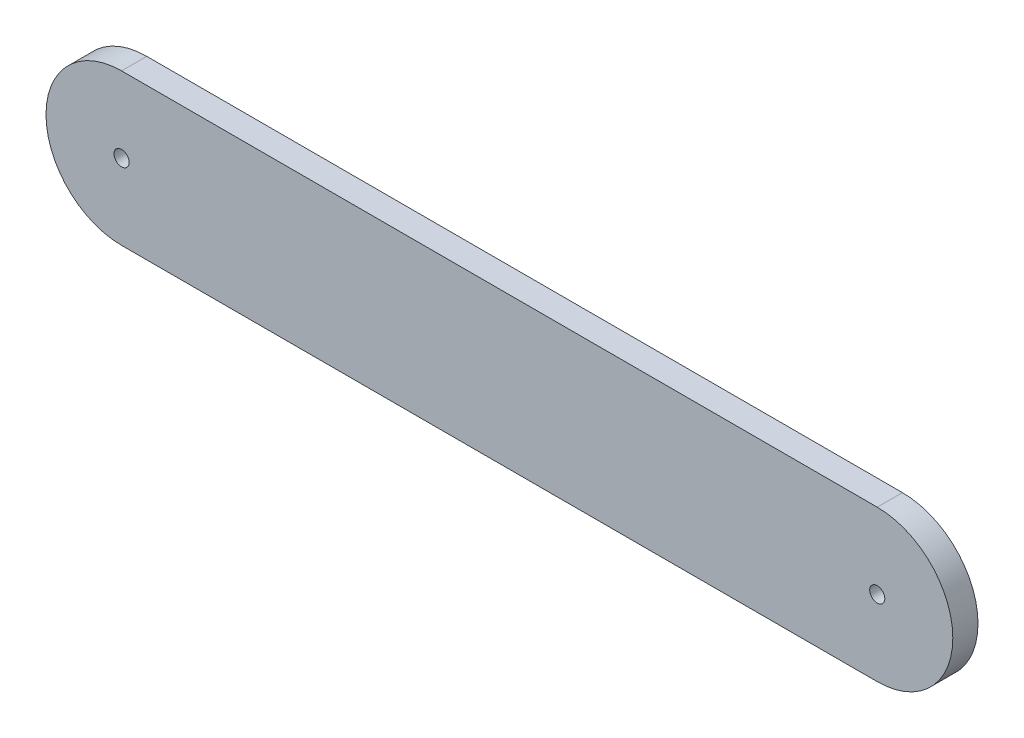
ISO-10303-21;
HEADER;
FILE_DESCRIPTION(('STEP AP214'),'2;1');
FILE_NAME('part.step','',(''),(''),'','','');
FILE_SCHEMA(('AUTOMOTIVE_DESIGN { 1 0 10303 214 1 1 1 1 }'));
ENDSEC;
DATA;
#1=APPLICATION_CONTEXT('core data for automotive mechanical design processes');
#2=APPLICATION_PROTOCOL_DEFINITION('international standard','automotive_design',2000,#1);
#3=PRODUCT_CONTEXT('',#1,'mechanical');
#4=PRODUCT('Part','Part','',(#3));
#5=PRODUCT_RELATED_PRODUCT_CATEGORY('part','',(#4));
#6=PRODUCT_DEFINITION_FORMATION('','',#4);
#7=PRODUCT_DEFINITION_CONTEXT('part definition',#1,'design');
#8=PRODUCT_DEFINITION('design','',#6,#7);
#9=PRODUCT_DEFINITION_SHAPE('','',#8);
#10=(LENGTH_UNIT() NAMED_UNIT(*) SI_UNIT(.MILLI.,.METRE.));
#11=(NAMED_UNIT(*) PLANE_ANGLE_UNIT() SI_UNIT($,.RADIAN.));
#12=(NAMED_UNIT(*) SI_UNIT($,.STERADIAN.) SOLID_ANGLE_UNIT());
#13=UNCERTAINTY_MEASURE_WITH_UNIT(LENGTH_MEASURE(1.E-05),#10,'distance_accuracy_value','');
#14=(GEOMETRIC_REPRESENTATION_CONTEXT(3) GLOBAL_UNCERTAINTY_ASSIGNED_CONTEXT((#13)) GLOBAL_UNIT_ASSIGNED_CONTEXT((#10,
#11,#12)) REPRESENTATION_CONTEXT('',''));
#15=CARTESIAN_POINT('',(0.,0.,0.));
#16=DIRECTION('',(0.,0.,1.));
#17=DIRECTION('',(1.,0.,0.));
#18=AXIS2_PLACEMENT_3D('',#15,#16,#17);
#19=CARTESIAN_POINT('',(-75.,0.,5.));
#20=DIRECTION('',(0.,0.,-1.));
#21=DIRECTION('',(-1.,0.,0.));
#22=AXIS2_PLACEMENT_3D('',#19,#20,#21);
#23=CYLINDRICAL_SURFACE('',#22,15.);
#24=CARTESIAN_POINT('',(-75.,0.,0.));
#25=DIRECTION('',(0.,0.,1.));
#26=DIRECTION('',(1.,0.,0.));
#27=AXIS2_PLACEMENT_3D('',#24,#25,#26);
#28=CIRCLE('',#27,15.);
#29=CARTESIAN_POINT('',(-75.,15.,0.));
#30=VERTEX_POINT('',#29);
#31=CARTESIAN_POINT('',(-75.,-15.,0.));
#32=VERTEX_POINT('',#31);
#33=EDGE_CURVE('E107',#30,#32,#28,.T.);
#34=ORIENTED_EDGE('',*,*,#33,.T.);
#35=DIRECTION('',(0.,0.,-1.));
#36=VECTOR('',#35,1.);
#37=CARTESIAN_POINT('',(-75.,-15.,5.));
#38=LINE('',#37,#36);
#39=CARTESIAN_POINT('',(-75.,-15.,5.));
#40=VERTEX_POINT('',#39);
#41=EDGE_CURVE('E11',#40,#32,#38,.T.);
#42=ORIENTED_EDGE('',*,*,#41,.F.);
#43=CARTESIAN_POINT('',(-75.,0.,5.));
#44=DIRECTION('',(0.,0.,1.));
#45=DIRECTION('',(1.,0.,0.));
#46=AXIS2_PLACEMENT_3D('',#43,#44,#45);
#47=CIRCLE('',#46,15.);
#48=CARTESIAN_POINT('',(-75.,15.,5.));
#49=VERTEX_POINT('',#48);
#50=EDGE_CURVE('E91',#49,#40,#47,.T.);
#51=ORIENTED_EDGE('',*,*,#50,.F.);
#52=DIRECTION('',(0.,0.,-1.));
#53=VECTOR('',#52,1.);
#54=CARTESIAN_POINT('',(-75.,15.,5.));
#55=LINE('',#54,#53);
#56=EDGE_CURVE('E103',#49,#30,#55,.T.);
#57=ORIENTED_EDGE('',*,*,#56,.T.);
#58=EDGE_LOOP('',(#34,#42,#51,#57));
#59=FACE_BOUND('',#58,.T.);
#60=ADVANCED_FACE('F39',(#59),#23,.T.);
#61=CARTESIAN_POINT('',(-75.,-15.,5.));
#62=DIRECTION('',(0.,1.,0.));
#63=DIRECTION('',(0.,0.,1.));
#64=AXIS2_PLACEMENT_3D('',#61,#62,#63);
#65=PLANE('',#64);
#66=DIRECTION('',(1.,0.,0.));
#67=VECTOR('',#66,1.);
#68=CARTESIAN_POINT('',(-75.,-15.,0.));
#69=LINE('',#68,#67);
#70=CARTESIAN_POINT('',(75.,-15.,0.));
#71=VERTEX_POINT('',#70);
#72=EDGE_CURVE('E96',#32,#71,#69,.T.);
#73=ORIENTED_EDGE('',*,*,#72,.T.);
#74=DIRECTION('',(0.,0.,-1.));
#75=VECTOR('',#74,1.);
#76=CARTESIAN_POINT('',(75.,-15.,5.));
#77=LINE('',#76,#75);
#78=CARTESIAN_POINT('',(75.,-15.,5.));
#79=VERTEX_POINT('',#78);
#80=EDGE_CURVE('E48',#79,#71,#77,.T.);
#81=ORIENTED_EDGE('',*,*,#80,.F.);
#82=DIRECTION('',(1.,0.,0.));
#83=VECTOR('',#82,1.);
#84=CARTESIAN_POINT('',(-75.,-15.,5.));
#85=LINE('',#84,#83);
#86=EDGE_CURVE('E86',#40,#79,#85,.T.);
#87=ORIENTED_EDGE('',*,*,#86,.F.);
#88=ORIENTED_EDGE('',*,*,#41,.T.);
#89=EDGE_LOOP('',(#73,#81,#87,#88));
#90=FACE_BOUND('',#89,.T.);
#91=ADVANCED_FACE('F95',(#90),#65,.F.);
#92=CARTESIAN_POINT('',(75.,0.,5.));
#93=DIRECTION('',(0.,0.,-1.));
#94=DIRECTION('',(-1.,0.,0.));
#95=AXIS2_PLACEMENT_3D('',#92,#93,#94);
#96=CYLINDRICAL_SURFACE('',#95,15.);
#97=CARTESIAN_POINT('',(75.,0.,0.));
#98=DIRECTION('',(0.,0.,1.));
#99=DIRECTION('',(1.,0.,0.));
#100=AXIS2_PLACEMENT_3D('',#97,#98,#99);
#101=CIRCLE('',#100,15.);
#102=CARTESIAN_POINT('',(75.,15.,0.));
#103=VERTEX_POINT('',#102);
#104=EDGE_CURVE('E73',#71,#103,#101,.T.);
#105=ORIENTED_EDGE('',*,*,#104,.T.);
#106=DIRECTION('',(0.,0.,-1.));
#107=VECTOR('',#106,1.);
#108=CARTESIAN_POINT('',(75.,15.,5.));
#109=LINE('',#108,#107);
#110=CARTESIAN_POINT('',(75.,15.,5.));
#111=VERTEX_POINT('',#110);
#112=EDGE_CURVE('E98',#111,#103,#109,.T.);
#113=ORIENTED_EDGE('',*,*,#112,.F.);
#114=CARTESIAN_POINT('',(75.,0.,5.));
#115=DIRECTION('',(0.,0.,1.));
#116=DIRECTION('',(1.,0.,0.));
#117=AXIS2_PLACEMENT_3D('',#114,#115,#116);
#118=CIRCLE('',#117,15.);
#119=EDGE_CURVE('E89',#79,#111,#118,.T.);
#120=ORIENTED_EDGE('',*,*,#119,.F.);
#121=ORIENTED_EDGE('',*,*,#80,.T.);
#122=EDGE_LOOP('',(#105,#113,#120,#121));
#123=FACE_BOUND('',#122,.T.);
#124=ADVANCED_FACE('F99',(#123),#96,.T.);
#125=CARTESIAN_POINT('',(-75.,15.,5.));
#126=DIRECTION('',(0.,-1.,0.));
#127=DIRECTION('',(0.,0.,-1.));
#128=AXIS2_PLACEMENT_3D('',#125,#126,#127);
#129=PLANE('',#128);
#130=DIRECTION('',(-1.,0.,0.));
#131=VECTOR('',#130,1.);
#132=CARTESIAN_POINT('',(-75.,15.,0.));
#133=LINE('',#132,#131);
#134=EDGE_CURVE('E79',#103,#30,#133,.T.);
#135=ORIENTED_EDGE('',*,*,#134,.T.);
#136=ORIENTED_EDGE('',*,*,#56,.F.);
#137=DIRECTION('',(-1.,0.,0.));
#138=VECTOR('',#137,1.);
#139=CARTESIAN_POINT('',(-75.,15.,5.));
#140=LINE('',#139,#138);
#141=EDGE_CURVE('E56',#111,#49,#140,.T.);
#142=ORIENTED_EDGE('',*,*,#141,.F.);
#143=ORIENTED_EDGE('',*,*,#112,.T.);
#144=EDGE_LOOP('',(#135,#136,#142,#143));
#145=FACE_BOUND('',#144,.T.);
#146=ADVANCED_FACE('F121',(#145),#129,.F.);
#147=CARTESIAN_POINT('',(-75.,0.,5.));
#148=DIRECTION('',(0.,0.,1.));
#149=DIRECTION('',(1.,0.,0.));
#150=AXIS2_PLACEMENT_3D('',#147,#148,#149);
#151=PLANE('',#150);
#152=CARTESIAN_POINT('',(-75.,0.,5.));
#153=DIRECTION('',(0.,0.,-1.));
#154=DIRECTION('',(-1.,0.,0.));
#155=AXIS2_PLACEMENT_3D('',#152,#153,#154);
#156=CIRCLE('',#155,1.5);
#157=CARTESIAN_POINT('',(-76.5,0.,5.));
#158=VERTEX_POINT('',#157);
#159=EDGE_CURVE('E111',#158,#158,#156,.T.);
#160=ORIENTED_EDGE('',*,*,#159,.T.);
#161=EDGE_LOOP('',(#160));
#162=FACE_BOUND('',#161,.T.);
#163=CARTESIAN_POINT('',(75.,0.,5.));
#164=DIRECTION('',(0.,0.,-1.));
#165=DIRECTION('',(-1.,0.,0.));
#166=AXIS2_PLACEMENT_3D('',#163,#164,#165);
#167=CIRCLE('',#166,1.5);
#168=CARTESIAN_POINT('',(73.5,0.,5.));
#169=VERTEX_POINT('',#168);
#170=EDGE_CURVE('E132',#169,#169,#167,.T.);
#171=ORIENTED_EDGE('',*,*,#170,.T.);
#172=EDGE_LOOP('',(#171));
#173=FACE_BOUND('',#172,.T.);
#174=ORIENTED_EDGE('',*,*,#50,.T.);
#175=ORIENTED_EDGE('',*,*,#86,.T.);
#176=ORIENTED_EDGE('',*,*,#119,.T.);
#177=ORIENTED_EDGE('',*,*,#141,.T.);
#178=EDGE_LOOP('',(#174,#175,#176,#177));
#179=FACE_BOUND('',#178,.T.);
#180=ADVANCED_FACE('F87',(#162,#173,#179),#151,.T.);
#181=CARTESIAN_POINT('',(-75.,0.,0.));
#182=DIRECTION('',(0.,0.,1.));
#183=DIRECTION('',(1.,0.,0.));
#184=AXIS2_PLACEMENT_3D('',#181,#182,#183);
#185=PLANE('',#184);
#186=CARTESIAN_POINT('',(-75.,0.,0.));
#187=DIRECTION('',(0.,0.,-1.));
#188=DIRECTION('',(-1.,0.,0.));
#189=AXIS2_PLACEMENT_3D('',#186,#187,#188);
#190=CIRCLE('',#189,1.5);
#191=CARTESIAN_POINT('',(-76.5,0.,0.));
#192=VERTEX_POINT('',#191);
#193=EDGE_CURVE('E136',#192,#192,#190,.T.);
#194=ORIENTED_EDGE('',*,*,#193,.F.);
#195=EDGE_LOOP('',(#194));
#196=FACE_BOUND('',#195,.T.);
#197=CARTESIAN_POINT('',(75.,0.,0.));
#198=DIRECTION('',(0.,0.,-1.));
#199=DIRECTION('',(-1.,0.,0.));
#200=AXIS2_PLACEMENT_3D('',#197,#198,#199);
#201=CIRCLE('',#200,1.5);
#202=CARTESIAN_POINT('',(73.5,0.,0.));
#203=VERTEX_POINT('',#202);
#204=EDGE_CURVE('E128',#203,#203,#201,.T.);
#205=ORIENTED_EDGE('',*,*,#204,.F.);
#206=EDGE_LOOP('',(#205));
#207=FACE_BOUND('',#206,.T.);
#208=ORIENTED_EDGE('',*,*,#33,.F.);
#209=ORIENTED_EDGE('',*,*,#134,.F.);
#210=ORIENTED_EDGE('',*,*,#104,.F.);
#211=ORIENTED_EDGE('',*,*,#72,.F.);
#212=EDGE_LOOP('',(#208,#209,#210,#211));
#213=FACE_BOUND('',#212,.T.);
#214=ADVANCED_FACE('F124',(#196,#207,#213),#185,.F.);
#215=CARTESIAN_POINT('',(75.,0.,5.));
#216=DIRECTION('',(0.,0.,-1.));
#217=DIRECTION('',(-1.,0.,0.));
#218=AXIS2_PLACEMENT_3D('',#215,#216,#217);
#219=CYLINDRICAL_SURFACE('',#218,1.5);
#220=ORIENTED_EDGE('',*,*,#170,.F.);
#221=EDGE_LOOP('',(#220));
#222=FACE_BOUND('',#221,.T.);
#223=ORIENTED_EDGE('',*,*,#204,.T.);
#224=EDGE_LOOP('',(#223));
#225=FACE_BOUND('',#224,.T.);
#226=ADVANCED_FACE('F149',(#222,#225),#219,.F.);
#227=CARTESIAN_POINT('',(-75.,0.,5.));
#228=DIRECTION('',(0.,0.,-1.));
#229=DIRECTION('',(-1.,0.,0.));
#230=AXIS2_PLACEMENT_3D('',#227,#228,#229);
#231=CYLINDRICAL_SURFACE('',#230,1.5);
#232=ORIENTED_EDGE('',*,*,#159,.F.);
#233=EDGE_LOOP('',(#232));
#234=FACE_BOUND('',#233,.T.);
#235=ORIENTED_EDGE('',*,*,#193,.T.);
#236=EDGE_LOOP('',(#235));
#237=FACE_BOUND('',#236,.T.);
#238=ADVANCED_FACE('F146',(#234,#237),#231,.F.);
#239=CLOSED_SHELL('',(#60,#91,#124,#146,#180,#214,#226,#238));
#240=MANIFOLD_SOLID_BREP('B2',#239);
#241=ADVANCED_BREP_SHAPE_REPRESENTATION('',(#18,#240),#14);
#242=SHAPE_DEFINITION_REPRESENTATION(#9,#241);
ENDSEC;
END-ISO-10303-21;
